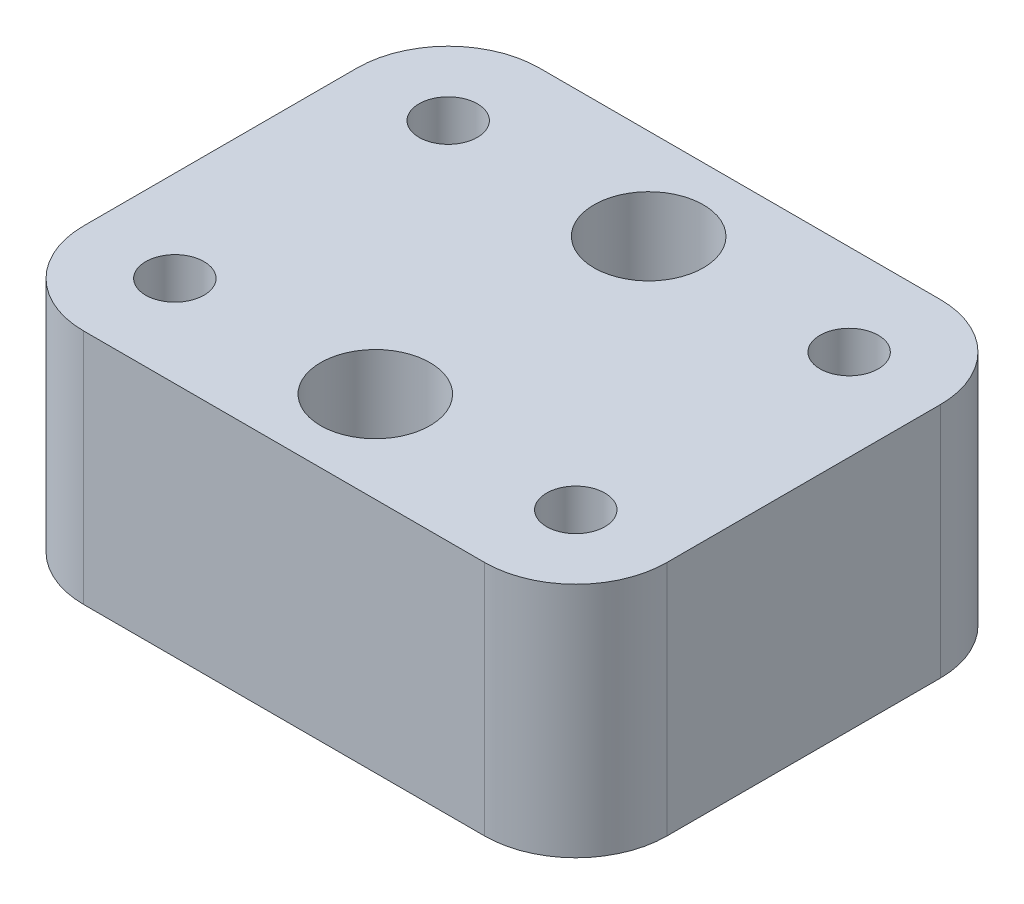
ISO-10303-21;
HEADER;
FILE_DESCRIPTION(('STEP AP214'),'2;1');
FILE_NAME('part.step','',(''),(''),'','','');
FILE_SCHEMA(('AUTOMOTIVE_DESIGN { 1 0 10303 214 1 1 1 1 }'));
ENDSEC;
DATA;
#1=APPLICATION_CONTEXT('core data for automotive mechanical design processes');
#2=APPLICATION_PROTOCOL_DEFINITION('international standard','automotive_design',2000,#1);
#3=PRODUCT_CONTEXT('',#1,'mechanical');
#4=PRODUCT('Part','Part','',(#3));
#5=PRODUCT_RELATED_PRODUCT_CATEGORY('part','',(#4));
#6=PRODUCT_DEFINITION_FORMATION('','',#4);
#7=PRODUCT_DEFINITION_CONTEXT('part definition',#1,'design');
#8=PRODUCT_DEFINITION('design','',#6,#7);
#9=PRODUCT_DEFINITION_SHAPE('','',#8);
#10=(LENGTH_UNIT() NAMED_UNIT(*) SI_UNIT(.MILLI.,.METRE.));
#11=(NAMED_UNIT(*) PLANE_ANGLE_UNIT() SI_UNIT($,.RADIAN.));
#12=(NAMED_UNIT(*) SI_UNIT($,.STERADIAN.) SOLID_ANGLE_UNIT());
#13=UNCERTAINTY_MEASURE_WITH_UNIT(LENGTH_MEASURE(1.E-05),#10,'distance_accuracy_value','');
#14=(GEOMETRIC_REPRESENTATION_CONTEXT(3) GLOBAL_UNCERTAINTY_ASSIGNED_CONTEXT((#13)) GLOBAL_UNIT_ASSIGNED_CONTEXT((#10,
#11,#12)) REPRESENTATION_CONTEXT('',''));
#15=CARTESIAN_POINT('',(0.,0.,0.));
#16=DIRECTION('',(0.,0.,1.));
#17=DIRECTION('',(1.,0.,0.));
#18=AXIS2_PLACEMENT_3D('',#15,#16,#17);
#19=CARTESIAN_POINT('',(0.,18.,0.));
#20=DIRECTION('',(0.,0.,-1.));
#21=DIRECTION('',(-1.,0.,0.));
#22=AXIS2_PLACEMENT_3D('',#19,#20,#21);
#23=PLANE('',#22);
#24=DIRECTION('',(0.,-1.,0.));
#25=VECTOR('',#24,1.);
#26=CARTESIAN_POINT('',(5.,0.,0.));
#27=LINE('',#26,#25);
#28=CARTESIAN_POINT('',(5.,27.,0.));
#29=VERTEX_POINT('',#28);
#30=CARTESIAN_POINT('',(5.,14.,0.));
#31=VERTEX_POINT('',#30);
#32=EDGE_CURVE('E50',#29,#31,#27,.T.);
#33=ORIENTED_EDGE('',*,*,#32,.T.);
#34=DIRECTION('',(1.,0.,0.));
#35=VECTOR('',#34,1.);
#36=CARTESIAN_POINT('',(0.,14.,0.));
#37=LINE('',#36,#35);
#38=CARTESIAN_POINT('',(27.,14.,0.));
#39=VERTEX_POINT('',#38);
#40=EDGE_CURVE('E154',#31,#39,#37,.T.);
#41=ORIENTED_EDGE('',*,*,#40,.T.);
#42=DIRECTION('',(0.,-1.,0.));
#43=VECTOR('',#42,1.);
#44=CARTESIAN_POINT('',(27.,18.,0.));
#45=LINE('',#44,#43);
#46=CARTESIAN_POINT('',(27.,27.,0.));
#47=VERTEX_POINT('',#46);
#48=EDGE_CURVE('E11',#39,#47,#45,.F.);
#49=ORIENTED_EDGE('',*,*,#48,.T.);
#50=DIRECTION('',(1.,0.,0.));
#51=VECTOR('',#50,1.);
#52=CARTESIAN_POINT('',(27.,27.,0.));
#53=LINE('',#52,#51);
#54=EDGE_CURVE('E139',#29,#47,#53,.T.);
#55=ORIENTED_EDGE('',*,*,#54,.F.);
#56=EDGE_LOOP('',(#33,#41,#49,#55));
#57=FACE_BOUND('',#56,.T.);
#58=ADVANCED_FACE('F41',(#57),#23,.F.);
#59=CARTESIAN_POINT('',(27.,18.,-5.));
#60=DIRECTION('',(0.,-1.,0.));
#61=DIRECTION('',(0.,0.,-1.));
#62=AXIS2_PLACEMENT_3D('',#59,#60,#61);
#63=CYLINDRICAL_SURFACE('',#62,5.);
#64=CARTESIAN_POINT('',(27.,14.,-5.));
#65=DIRECTION('',(0.,1.,0.));
#66=DIRECTION('',(0.,0.,1.));
#67=AXIS2_PLACEMENT_3D('',#64,#65,#66);
#68=CIRCLE('',#67,5.);
#69=CARTESIAN_POINT('',(32.,14.,-5.));
#70=VERTEX_POINT('',#69);
#71=EDGE_CURVE('E158',#70,#39,#68,.F.);
#72=ORIENTED_EDGE('',*,*,#71,.F.);
#73=DIRECTION('',(0.,-1.,0.));
#74=VECTOR('',#73,1.);
#75=CARTESIAN_POINT('',(32.,18.,-5.));
#76=LINE('',#75,#74);
#77=CARTESIAN_POINT('',(32.,27.,-5.));
#78=VERTEX_POINT('',#77);
#79=EDGE_CURVE('E113',#78,#70,#76,.T.);
#80=ORIENTED_EDGE('',*,*,#79,.F.);
#81=CARTESIAN_POINT('',(27.,27.,-5.));
#82=DIRECTION('',(0.,1.,0.));
#83=DIRECTION('',(0.,0.,1.));
#84=AXIS2_PLACEMENT_3D('',#81,#82,#83);
#85=CIRCLE('',#84,5.);
#86=EDGE_CURVE('E142',#47,#78,#85,.T.);
#87=ORIENTED_EDGE('',*,*,#86,.F.);
#88=ORIENTED_EDGE('',*,*,#48,.F.);
#89=EDGE_LOOP('',(#72,#80,#87,#88));
#90=FACE_BOUND('',#89,.T.);
#91=ADVANCED_FACE('F238',(#90),#63,.T.);
#92=CARTESIAN_POINT('',(5.,18.,-5.));
#93=DIRECTION('',(0.,1.,0.));
#94=DIRECTION('',(0.,0.,1.));
#95=AXIS2_PLACEMENT_3D('',#92,#93,#94);
#96=CYLINDRICAL_SURFACE('',#95,5.);
#97=CARTESIAN_POINT('',(5.,14.,-5.));
#98=DIRECTION('',(0.,1.,0.));
#99=DIRECTION('',(0.,0.,1.));
#100=AXIS2_PLACEMENT_3D('',#97,#98,#99);
#101=CIRCLE('',#100,5.);
#102=CARTESIAN_POINT('',(0.,14.,-5.));
#103=VERTEX_POINT('',#102);
#104=EDGE_CURVE('E152',#31,#103,#101,.F.);
#105=ORIENTED_EDGE('',*,*,#104,.F.);
#106=ORIENTED_EDGE('',*,*,#32,.F.);
#107=CARTESIAN_POINT('',(5.,27.,-5.));
#108=DIRECTION('',(0.,1.,0.));
#109=DIRECTION('',(0.,0.,1.));
#110=AXIS2_PLACEMENT_3D('',#107,#108,#109);
#111=CIRCLE('',#110,5.);
#112=CARTESIAN_POINT('',(0.,27.,-5.));
#113=VERTEX_POINT('',#112);
#114=EDGE_CURVE('E123',#113,#29,#111,.T.);
#115=ORIENTED_EDGE('',*,*,#114,.F.);
#116=DIRECTION('',(0.,-1.,0.));
#117=VECTOR('',#116,1.);
#118=CARTESIAN_POINT('',(0.,18.,-5.));
#119=LINE('',#118,#117);
#120=EDGE_CURVE('E119',#113,#103,#119,.T.);
#121=ORIENTED_EDGE('',*,*,#120,.T.);
#122=EDGE_LOOP('',(#105,#106,#115,#121));
#123=FACE_BOUND('',#122,.T.);
#124=ADVANCED_FACE('F43',(#123),#96,.T.);
#125=CARTESIAN_POINT('',(32.,14.,0.));
#126=DIRECTION('',(-1.,0.,0.));
#127=DIRECTION('',(0.,0.,1.));
#128=AXIS2_PLACEMENT_3D('',#125,#126,#127);
#129=PLANE('',#128);
#130=DIRECTION('',(0.,1.,0.));
#131=VECTOR('',#130,1.);
#132=CARTESIAN_POINT('',(32.,14.,-20.));
#133=LINE('',#132,#131);
#134=CARTESIAN_POINT('',(32.,14.,-20.));
#135=VERTEX_POINT('',#134);
#136=CARTESIAN_POINT('',(32.,27.,-20.));
#137=VERTEX_POINT('',#136);
#138=EDGE_CURVE('E168',#135,#137,#133,.T.);
#139=ORIENTED_EDGE('',*,*,#138,.T.);
#140=DIRECTION('',(0.,0.,-1.));
#141=VECTOR('',#140,1.);
#142=CARTESIAN_POINT('',(32.,27.,-20.));
#143=LINE('',#142,#141);
#144=EDGE_CURVE('E145',#78,#137,#143,.T.);
#145=ORIENTED_EDGE('',*,*,#144,.F.);
#146=ORIENTED_EDGE('',*,*,#79,.T.);
#147=DIRECTION('',(0.,0.,1.));
#148=VECTOR('',#147,1.);
#149=CARTESIAN_POINT('',(32.,14.,0.));
#150=LINE('',#149,#148);
#151=EDGE_CURVE('E160',#135,#70,#150,.T.);
#152=ORIENTED_EDGE('',*,*,#151,.F.);
#153=EDGE_LOOP('',(#139,#145,#146,#152));
#154=FACE_BOUND('',#153,.T.);
#155=ADVANCED_FACE('F247',(#154),#129,.F.);
#156=CARTESIAN_POINT('',(0.,14.,0.));
#157=DIRECTION('',(1.,0.,0.));
#158=DIRECTION('',(0.,0.,-1.));
#159=AXIS2_PLACEMENT_3D('',#156,#157,#158);
#160=PLANE('',#159);
#161=ORIENTED_EDGE('',*,*,#120,.F.);
#162=DIRECTION('',(0.,0.,1.));
#163=VECTOR('',#162,1.);
#164=CARTESIAN_POINT('',(0.,27.,-20.));
#165=LINE('',#164,#163);
#166=CARTESIAN_POINT('',(0.,27.,-20.));
#167=VERTEX_POINT('',#166);
#168=EDGE_CURVE('E116',#167,#113,#165,.T.);
#169=ORIENTED_EDGE('',*,*,#168,.F.);
#170=DIRECTION('',(0.,1.,0.));
#171=VECTOR('',#170,1.);
#172=CARTESIAN_POINT('',(0.,14.,-20.));
#173=LINE('',#172,#171);
#174=CARTESIAN_POINT('',(0.,14.,-20.));
#175=VERTEX_POINT('',#174);
#176=EDGE_CURVE('E106',#175,#167,#173,.T.);
#177=ORIENTED_EDGE('',*,*,#176,.F.);
#178=DIRECTION('',(0.,0.,-1.));
#179=VECTOR('',#178,1.);
#180=CARTESIAN_POINT('',(0.,14.,0.));
#181=LINE('',#180,#179);
#182=EDGE_CURVE('E58',#103,#175,#181,.T.);
#183=ORIENTED_EDGE('',*,*,#182,.F.);
#184=EDGE_LOOP('',(#161,#169,#177,#183));
#185=FACE_BOUND('',#184,.T.);
#186=ADVANCED_FACE('F117',(#185),#160,.F.);
#187=CARTESIAN_POINT('',(5.,14.,-20.));
#188=DIRECTION('',(0.,1.,0.));
#189=DIRECTION('',(0.,0.,1.));
#190=AXIS2_PLACEMENT_3D('',#187,#188,#189);
#191=CYLINDRICAL_SURFACE('',#190,5.);
#192=ORIENTED_EDGE('',*,*,#176,.T.);
#193=CARTESIAN_POINT('',(5.,27.,-20.));
#194=DIRECTION('',(0.,1.,0.));
#195=DIRECTION('',(0.,0.,1.));
#196=AXIS2_PLACEMENT_3D('',#193,#194,#195);
#197=CIRCLE('',#196,5.);
#198=CARTESIAN_POINT('',(5.,27.,-25.));
#199=VERTEX_POINT('',#198);
#200=EDGE_CURVE('E110',#199,#167,#197,.T.);
#201=ORIENTED_EDGE('',*,*,#200,.F.);
#202=DIRECTION('',(0.,1.,0.));
#203=VECTOR('',#202,1.);
#204=CARTESIAN_POINT('',(5.,14.,-25.));
#205=LINE('',#204,#203);
#206=CARTESIAN_POINT('',(5.,14.,-25.));
#207=VERTEX_POINT('',#206);
#208=EDGE_CURVE('E66',#207,#199,#205,.T.);
#209=ORIENTED_EDGE('',*,*,#208,.F.);
#210=CARTESIAN_POINT('',(5.,14.,-20.));
#211=DIRECTION('',(0.,1.,0.));
#212=DIRECTION('',(0.,0.,1.));
#213=AXIS2_PLACEMENT_3D('',#210,#211,#212);
#214=CIRCLE('',#213,5.);
#215=EDGE_CURVE('E111',#207,#175,#214,.T.);
#216=ORIENTED_EDGE('',*,*,#215,.T.);
#217=EDGE_LOOP('',(#192,#201,#209,#216));
#218=FACE_BOUND('',#217,.T.);
#219=ADVANCED_FACE('F108',(#218),#191,.T.);
#220=CARTESIAN_POINT('',(0.,14.,-25.));
#221=DIRECTION('',(0.,0.,1.));
#222=DIRECTION('',(1.,0.,0.));
#223=AXIS2_PLACEMENT_3D('',#220,#221,#222);
#224=PLANE('',#223);
#225=ORIENTED_EDGE('',*,*,#208,.T.);
#226=DIRECTION('',(-1.,0.,0.));
#227=VECTOR('',#226,1.);
#228=CARTESIAN_POINT('',(5.,27.,-25.));
#229=LINE('',#228,#227);
#230=CARTESIAN_POINT('',(27.,27.,-25.));
#231=VERTEX_POINT('',#230);
#232=EDGE_CURVE('E130',#231,#199,#229,.T.);
#233=ORIENTED_EDGE('',*,*,#232,.F.);
#234=DIRECTION('',(0.,1.,0.));
#235=VECTOR('',#234,1.);
#236=CARTESIAN_POINT('',(27.,14.,-25.));
#237=LINE('',#236,#235);
#238=CARTESIAN_POINT('',(27.,14.,-25.));
#239=VERTEX_POINT('',#238);
#240=EDGE_CURVE('E171',#239,#231,#237,.T.);
#241=ORIENTED_EDGE('',*,*,#240,.F.);
#242=DIRECTION('',(1.,0.,0.));
#243=VECTOR('',#242,1.);
#244=CARTESIAN_POINT('',(0.,14.,-25.));
#245=LINE('',#244,#243);
#246=EDGE_CURVE('E165',#207,#239,#245,.T.);
#247=ORIENTED_EDGE('',*,*,#246,.F.);
#248=EDGE_LOOP('',(#225,#233,#241,#247));
#249=FACE_BOUND('',#248,.T.);
#250=ADVANCED_FACE('F254',(#249),#224,.F.);
#251=CARTESIAN_POINT('',(27.,14.,-20.));
#252=DIRECTION('',(0.,1.,0.));
#253=DIRECTION('',(0.,0.,1.));
#254=AXIS2_PLACEMENT_3D('',#251,#252,#253);
#255=CYLINDRICAL_SURFACE('',#254,5.);
#256=ORIENTED_EDGE('',*,*,#240,.T.);
#257=CARTESIAN_POINT('',(27.,27.,-20.));
#258=DIRECTION('',(0.,1.,0.));
#259=DIRECTION('',(0.,0.,1.));
#260=AXIS2_PLACEMENT_3D('',#257,#258,#259);
#261=CIRCLE('',#260,5.);
#262=EDGE_CURVE('E148',#137,#231,#261,.T.);
#263=ORIENTED_EDGE('',*,*,#262,.F.);
#264=ORIENTED_EDGE('',*,*,#138,.F.);
#265=CARTESIAN_POINT('',(27.,14.,-20.));
#266=DIRECTION('',(0.,1.,0.));
#267=DIRECTION('',(0.,0.,1.));
#268=AXIS2_PLACEMENT_3D('',#265,#266,#267);
#269=CIRCLE('',#268,5.);
#270=EDGE_CURVE('E162',#135,#239,#269,.T.);
#271=ORIENTED_EDGE('',*,*,#270,.T.);
#272=EDGE_LOOP('',(#256,#263,#264,#271));
#273=FACE_BOUND('',#272,.T.);
#274=ADVANCED_FACE('F251',(#273),#255,.T.);
#275=CARTESIAN_POINT('',(0.,14.,0.));
#276=DIRECTION('',(0.,1.,0.));
#277=DIRECTION('',(0.,0.,1.));
#278=AXIS2_PLACEMENT_3D('',#275,#276,#277);
#279=PLANE('',#278);
#280=CARTESIAN_POINT('',(16.,14.,-20.));
#281=DIRECTION('',(0.,1.,0.));
#282=DIRECTION('',(0.,0.,1.));
#283=AXIS2_PLACEMENT_3D('',#280,#281,#282);
#284=CIRCLE('',#283,3.);
#285=CARTESIAN_POINT('',(16.,14.,-17.));
#286=VERTEX_POINT('',#285);
#287=EDGE_CURVE('E45',#286,#286,#284,.T.);
#288=ORIENTED_EDGE('',*,*,#287,.T.);
#289=EDGE_LOOP('',(#288));
#290=FACE_BOUND('',#289,.T.);
#291=CARTESIAN_POINT('',(16.,14.,-5.));
#292=DIRECTION('',(0.,1.,0.));
#293=DIRECTION('',(0.,0.,1.));
#294=AXIS2_PLACEMENT_3D('',#291,#292,#293);
#295=CIRCLE('',#294,3.);
#296=CARTESIAN_POINT('',(16.,14.,-2.));
#297=VERTEX_POINT('',#296);
#298=EDGE_CURVE('E151',#297,#297,#295,.T.);
#299=ORIENTED_EDGE('',*,*,#298,.T.);
#300=EDGE_LOOP('',(#299));
#301=FACE_BOUND('',#300,.T.);
#302=CARTESIAN_POINT('',(27.,14.,-20.));
#303=DIRECTION('',(0.,1.,0.));
#304=DIRECTION('',(0.,0.,1.));
#305=AXIS2_PLACEMENT_3D('',#302,#303,#304);
#306=CIRCLE('',#305,1.6);
#307=CARTESIAN_POINT('',(27.,14.,-18.4));
#308=VERTEX_POINT('',#307);
#309=EDGE_CURVE('E155',#308,#308,#306,.T.);
#310=ORIENTED_EDGE('',*,*,#309,.T.);
#311=EDGE_LOOP('',(#310));
#312=FACE_BOUND('',#311,.T.);
#313=CARTESIAN_POINT('',(27.,14.,-5.));
#314=DIRECTION('',(0.,1.,0.));
#315=DIRECTION('',(0.,0.,1.));
#316=AXIS2_PLACEMENT_3D('',#313,#314,#315);
#317=CIRCLE('',#316,1.6);
#318=CARTESIAN_POINT('',(27.,14.,-3.4));
#319=VERTEX_POINT('',#318);
#320=EDGE_CURVE('E185',#319,#319,#317,.T.);
#321=ORIENTED_EDGE('',*,*,#320,.T.);
#322=EDGE_LOOP('',(#321));
#323=FACE_BOUND('',#322,.T.);
#324=CARTESIAN_POINT('',(5.,14.,-5.));
#325=DIRECTION('',(0.,1.,0.));
#326=DIRECTION('',(0.,0.,1.));
#327=AXIS2_PLACEMENT_3D('',#324,#325,#326);
#328=CIRCLE('',#327,1.6);
#329=CARTESIAN_POINT('',(5.,14.,-3.4));
#330=VERTEX_POINT('',#329);
#331=EDGE_CURVE('E182',#330,#330,#328,.T.);
#332=ORIENTED_EDGE('',*,*,#331,.T.);
#333=EDGE_LOOP('',(#332));
#334=FACE_BOUND('',#333,.T.);
#335=CARTESIAN_POINT('',(5.,14.,-20.));
#336=DIRECTION('',(0.,1.,0.));
#337=DIRECTION('',(0.,0.,1.));
#338=AXIS2_PLACEMENT_3D('',#335,#336,#337);
#339=CIRCLE('',#338,1.6);
#340=CARTESIAN_POINT('',(5.,14.,-18.4));
#341=VERTEX_POINT('',#340);
#342=EDGE_CURVE('E179',#341,#341,#339,.T.);
#343=ORIENTED_EDGE('',*,*,#342,.T.);
#344=EDGE_LOOP('',(#343));
#345=FACE_BOUND('',#344,.T.);
#346=ORIENTED_EDGE('',*,*,#104,.T.);
#347=ORIENTED_EDGE('',*,*,#182,.T.);
#348=ORIENTED_EDGE('',*,*,#215,.F.);
#349=ORIENTED_EDGE('',*,*,#246,.T.);
#350=ORIENTED_EDGE('',*,*,#270,.F.);
#351=ORIENTED_EDGE('',*,*,#151,.T.);
#352=ORIENTED_EDGE('',*,*,#71,.T.);
#353=ORIENTED_EDGE('',*,*,#40,.F.);
#354=EDGE_LOOP('',(#346,#347,#348,#349,#350,#351,#352,#353));
#355=FACE_BOUND('',#354,.T.);
#356=ADVANCED_FACE('F195',(#290,#301,#312,#323,#334,#345,#355),#279,.F.);
#357=CARTESIAN_POINT('',(5.,9.,-20.));
#358=DIRECTION('',(0.,1.,0.));
#359=DIRECTION('',(0.,0.,1.));
#360=AXIS2_PLACEMENT_3D('',#357,#358,#359);
#361=CYLINDRICAL_SURFACE('',#360,1.6);
#362=ORIENTED_EDGE('',*,*,#342,.F.);
#363=EDGE_LOOP('',(#362));
#364=FACE_BOUND('',#363,.T.);
#365=CARTESIAN_POINT('',(5.,27.,-20.));
#366=DIRECTION('',(0.,1.,0.));
#367=DIRECTION('',(0.,0.,1.));
#368=AXIS2_PLACEMENT_3D('',#365,#366,#367);
#369=CIRCLE('',#368,1.6);
#370=CARTESIAN_POINT('',(5.,27.,-18.4));
#371=VERTEX_POINT('',#370);
#372=EDGE_CURVE('E206',#371,#371,#369,.T.);
#373=ORIENTED_EDGE('',*,*,#372,.T.);
#374=EDGE_LOOP('',(#373));
#375=FACE_BOUND('',#374,.T.);
#376=ADVANCED_FACE('F264',(#364,#375),#361,.F.);
#377=CARTESIAN_POINT('',(5.,9.,-5.));
#378=DIRECTION('',(0.,1.,0.));
#379=DIRECTION('',(0.,0.,1.));
#380=AXIS2_PLACEMENT_3D('',#377,#378,#379);
#381=CYLINDRICAL_SURFACE('',#380,1.6);
#382=ORIENTED_EDGE('',*,*,#331,.F.);
#383=EDGE_LOOP('',(#382));
#384=FACE_BOUND('',#383,.T.);
#385=CARTESIAN_POINT('',(5.,27.,-5.));
#386=DIRECTION('',(0.,1.,0.));
#387=DIRECTION('',(0.,0.,1.));
#388=AXIS2_PLACEMENT_3D('',#385,#386,#387);
#389=CIRCLE('',#388,1.6);
#390=CARTESIAN_POINT('',(5.,27.,-3.4));
#391=VERTEX_POINT('',#390);
#392=EDGE_CURVE('E210',#391,#391,#389,.T.);
#393=ORIENTED_EDGE('',*,*,#392,.T.);
#394=EDGE_LOOP('',(#393));
#395=FACE_BOUND('',#394,.T.);
#396=ADVANCED_FACE('F266',(#384,#395),#381,.F.);
#397=CARTESIAN_POINT('',(27.,9.,-5.));
#398=DIRECTION('',(0.,1.,0.));
#399=DIRECTION('',(0.,0.,1.));
#400=AXIS2_PLACEMENT_3D('',#397,#398,#399);
#401=CYLINDRICAL_SURFACE('',#400,1.6);
#402=ORIENTED_EDGE('',*,*,#320,.F.);
#403=EDGE_LOOP('',(#402));
#404=FACE_BOUND('',#403,.T.);
#405=CARTESIAN_POINT('',(27.,27.,-5.));
#406=DIRECTION('',(0.,1.,0.));
#407=DIRECTION('',(0.,0.,1.));
#408=AXIS2_PLACEMENT_3D('',#405,#406,#407);
#409=CIRCLE('',#408,1.6);
#410=CARTESIAN_POINT('',(27.,27.,-3.4));
#411=VERTEX_POINT('',#410);
#412=EDGE_CURVE('E134',#411,#411,#409,.T.);
#413=ORIENTED_EDGE('',*,*,#412,.T.);
#414=EDGE_LOOP('',(#413));
#415=FACE_BOUND('',#414,.T.);
#416=ADVANCED_FACE('F219',(#404,#415),#401,.F.);
#417=CARTESIAN_POINT('',(27.,9.,-20.));
#418=DIRECTION('',(0.,1.,0.));
#419=DIRECTION('',(0.,0.,1.));
#420=AXIS2_PLACEMENT_3D('',#417,#418,#419);
#421=CYLINDRICAL_SURFACE('',#420,1.6);
#422=ORIENTED_EDGE('',*,*,#309,.F.);
#423=EDGE_LOOP('',(#422));
#424=FACE_BOUND('',#423,.T.);
#425=CARTESIAN_POINT('',(27.,27.,-20.));
#426=DIRECTION('',(0.,1.,0.));
#427=DIRECTION('',(0.,0.,1.));
#428=AXIS2_PLACEMENT_3D('',#425,#426,#427);
#429=CIRCLE('',#428,1.6);
#430=CARTESIAN_POINT('',(27.,27.,-18.4));
#431=VERTEX_POINT('',#430);
#432=EDGE_CURVE('E131',#431,#431,#429,.T.);
#433=ORIENTED_EDGE('',*,*,#432,.T.);
#434=EDGE_LOOP('',(#433));
#435=FACE_BOUND('',#434,.T.);
#436=ADVANCED_FACE('F228',(#424,#435),#421,.F.);
#437=CARTESIAN_POINT('',(16.,9.,-5.));
#438=DIRECTION('',(0.,1.,0.));
#439=DIRECTION('',(0.,0.,1.));
#440=AXIS2_PLACEMENT_3D('',#437,#438,#439);
#441=CYLINDRICAL_SURFACE('',#440,3.);
#442=ORIENTED_EDGE('',*,*,#298,.F.);
#443=EDGE_LOOP('',(#442));
#444=FACE_BOUND('',#443,.T.);
#445=CARTESIAN_POINT('',(16.,27.,-5.));
#446=DIRECTION('',(0.,1.,0.));
#447=DIRECTION('',(0.,0.,1.));
#448=AXIS2_PLACEMENT_3D('',#445,#446,#447);
#449=CIRCLE('',#448,3.);
#450=CARTESIAN_POINT('',(16.,27.,-2.));
#451=VERTEX_POINT('',#450);
#452=EDGE_CURVE('E207',#451,#451,#449,.T.);
#453=ORIENTED_EDGE('',*,*,#452,.T.);
#454=EDGE_LOOP('',(#453));
#455=FACE_BOUND('',#454,.T.);
#456=ADVANCED_FACE('F200',(#444,#455),#441,.F.);
#457=CARTESIAN_POINT('',(16.,9.,-20.));
#458=DIRECTION('',(0.,1.,0.));
#459=DIRECTION('',(0.,0.,1.));
#460=AXIS2_PLACEMENT_3D('',#457,#458,#459);
#461=CYLINDRICAL_SURFACE('',#460,3.);
#462=ORIENTED_EDGE('',*,*,#287,.F.);
#463=EDGE_LOOP('',(#462));
#464=FACE_BOUND('',#463,.T.);
#465=CARTESIAN_POINT('',(16.,27.,-20.));
#466=DIRECTION('',(0.,1.,0.));
#467=DIRECTION('',(0.,0.,1.));
#468=AXIS2_PLACEMENT_3D('',#465,#466,#467);
#469=CIRCLE('',#468,3.);
#470=CARTESIAN_POINT('',(16.,27.,-17.));
#471=VERTEX_POINT('',#470);
#472=EDGE_CURVE('E204',#471,#471,#469,.T.);
#473=ORIENTED_EDGE('',*,*,#472,.T.);
#474=EDGE_LOOP('',(#473));
#475=FACE_BOUND('',#474,.T.);
#476=ADVANCED_FACE('F197',(#464,#475),#461,.F.);
#477=CARTESIAN_POINT('',(5.,27.,-20.));
#478=DIRECTION('',(0.,1.,0.));
#479=DIRECTION('',(0.,0.,1.));
#480=AXIS2_PLACEMENT_3D('',#477,#478,#479);
#481=PLANE('',#480);
#482=ORIENTED_EDGE('',*,*,#472,.F.);
#483=EDGE_LOOP('',(#482));
#484=FACE_BOUND('',#483,.T.);
#485=ORIENTED_EDGE('',*,*,#392,.F.);
#486=EDGE_LOOP('',(#485));
#487=FACE_BOUND('',#486,.T.);
#488=ORIENTED_EDGE('',*,*,#432,.F.);
#489=EDGE_LOOP('',(#488));
#490=FACE_BOUND('',#489,.T.);
#491=ORIENTED_EDGE('',*,*,#200,.T.);
#492=ORIENTED_EDGE('',*,*,#168,.T.);
#493=ORIENTED_EDGE('',*,*,#114,.T.);
#494=ORIENTED_EDGE('',*,*,#54,.T.);
#495=ORIENTED_EDGE('',*,*,#86,.T.);
#496=ORIENTED_EDGE('',*,*,#144,.T.);
#497=ORIENTED_EDGE('',*,*,#262,.T.);
#498=ORIENTED_EDGE('',*,*,#232,.T.);
#499=EDGE_LOOP('',(#491,#492,#493,#494,#495,#496,#497,#498));
#500=FACE_BOUND('',#499,.T.);
#501=ORIENTED_EDGE('',*,*,#412,.F.);
#502=EDGE_LOOP('',(#501));
#503=FACE_BOUND('',#502,.T.);
#504=ORIENTED_EDGE('',*,*,#372,.F.);
#505=EDGE_LOOP('',(#504));
#506=FACE_BOUND('',#505,.T.);
#507=ORIENTED_EDGE('',*,*,#452,.F.);
#508=EDGE_LOOP('',(#507));
#509=FACE_BOUND('',#508,.T.);
#510=ADVANCED_FACE('F126',(#484,#487,#490,#500,#503,#506,#509),#481,.T.);
#511=CLOSED_SHELL('',(#58,#91,#124,#155,#186,#219,#250,#274,#356,#376,#396,#416,#436,#456,#476,#510));
#512=MANIFOLD_SOLID_BREP('B2',#511);
#513=ADVANCED_BREP_SHAPE_REPRESENTATION('',(#18,#512),#14);
#514=SHAPE_DEFINITION_REPRESENTATION(#9,#513);
ENDSEC;
END-ISO-10303-21;
